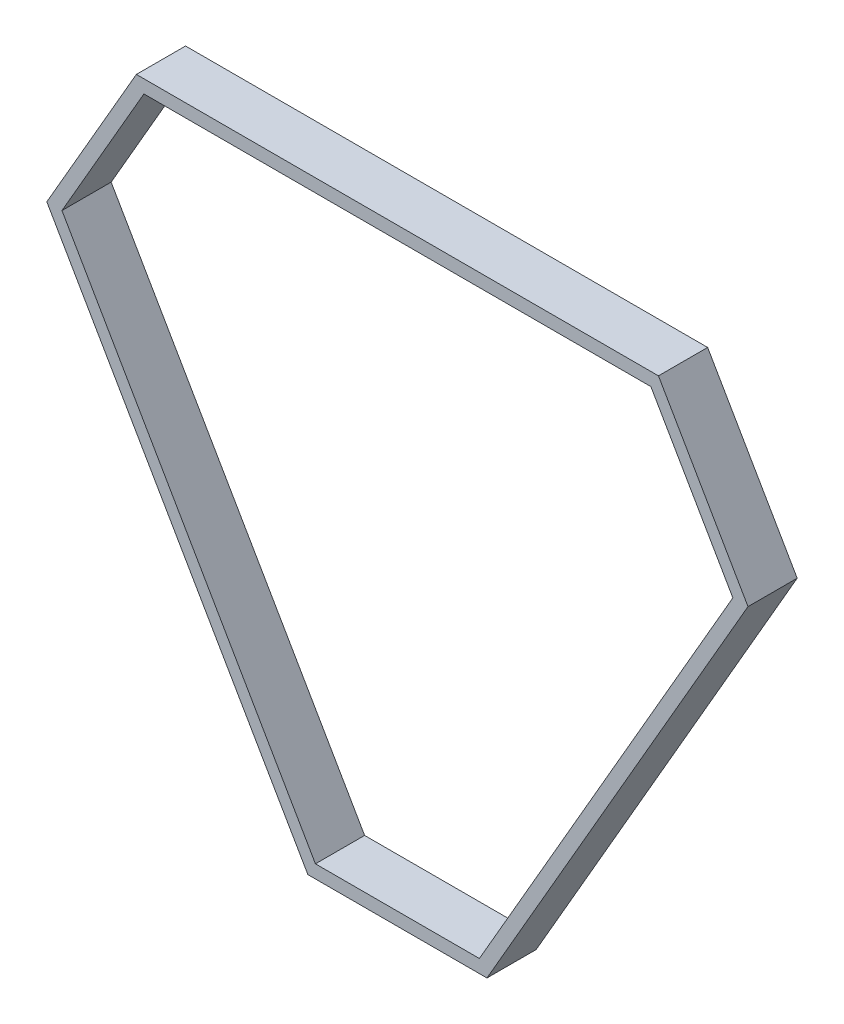
ISO-10303-21;
HEADER;
FILE_DESCRIPTION(('STEP AP214'),'2;1');
FILE_NAME('part.step','',(''),(''),'','','');
FILE_SCHEMA(('AUTOMOTIVE_DESIGN { 1 0 10303 214 1 1 1 1 }'));
ENDSEC;
DATA;
#1=APPLICATION_CONTEXT('core data for automotive mechanical design processes');
#2=APPLICATION_PROTOCOL_DEFINITION('international standard','automotive_design',2000,#1);
#3=PRODUCT_CONTEXT('',#1,'mechanical');
#4=PRODUCT('Part','Part','',(#3));
#5=PRODUCT_RELATED_PRODUCT_CATEGORY('part','',(#4));
#6=PRODUCT_DEFINITION_FORMATION('','',#4);
#7=PRODUCT_DEFINITION_CONTEXT('part definition',#1,'design');
#8=PRODUCT_DEFINITION('design','',#6,#7);
#9=PRODUCT_DEFINITION_SHAPE('','',#8);
#10=(LENGTH_UNIT() NAMED_UNIT(*) SI_UNIT(.MILLI.,.METRE.));
#11=(NAMED_UNIT(*) PLANE_ANGLE_UNIT() SI_UNIT($,.RADIAN.));
#12=(NAMED_UNIT(*) SI_UNIT($,.STERADIAN.) SOLID_ANGLE_UNIT());
#13=UNCERTAINTY_MEASURE_WITH_UNIT(LENGTH_MEASURE(1.E-05),#10,'distance_accuracy_value','');
#14=(GEOMETRIC_REPRESENTATION_CONTEXT(3) GLOBAL_UNCERTAINTY_ASSIGNED_CONTEXT((#13)) GLOBAL_UNIT_ASSIGNED_CONTEXT((#10,
#11,#12)) REPRESENTATION_CONTEXT('',''));
#15=CARTESIAN_POINT('',(0.,0.,0.));
#16=DIRECTION('',(0.,0.,1.));
#17=DIRECTION('',(1.,0.,0.));
#18=AXIS2_PLACEMENT_3D('',#15,#16,#17);
#19=CARTESIAN_POINT('',(0.,0.,-250.));
#20=DIRECTION('',(0.,0.,1.));
#21=DIRECTION('',(1.,0.,0.));
#22=AXIS2_PLACEMENT_3D('',#19,#20,#21);
#23=PLANE('',#22);
#24=DIRECTION('',(0.499999995522719,-0.866025406369398,0.));
#25=VECTOR('',#24,1.);
#26=CARTESIAN_POINT('',(-3.99997235182845,-287.07186238818,-250.));
#27=LINE('',#26,#25);
#28=CARTESIAN_POINT('',(-204.611479041461,60.3974639297883,-250.));
#29=VERTEX_POINT('',#28);
#30=CARTESIAN_POINT('',(-49.9999985666202,-207.397470720706,-250.));
#31=VERTEX_POINT('',#30);
#32=EDGE_CURVE('E146',#29,#31,#27,.T.);
#33=ORIENTED_EDGE('',*,*,#32,.T.);
#34=DIRECTION('',(1.,0.,0.));
#35=VECTOR('',#34,1.);
#36=CARTESIAN_POINT('',(3.99999495354567,-207.397470720707,-250.));
#37=LINE('',#36,#35);
#38=CARTESIAN_POINT('',(50.0000572399014,-207.397470720707,-250.));
#39=VERTEX_POINT('',#38);
#40=EDGE_CURVE('E155',#31,#39,#37,.T.);
#41=ORIENTED_EDGE('',*,*,#40,.T.);
#42=DIRECTION('',(0.499999988947861,0.866025410165394,0.));
#43=VECTOR('',#42,1.);
#44=CARTESIAN_POINT('',(250.611606942048,140.071936189287,-250.));
#45=LINE('',#44,#43);
#46=CARTESIAN_POINT('',(204.611504666339,60.3974195461969,-250.));
#47=VERTEX_POINT('',#46);
#48=EDGE_CURVE('E147',#39,#47,#45,.T.);
#49=ORIENTED_EDGE('',*,*,#48,.T.);
#50=DIRECTION('',(-0.499999999999999,0.866025403784439,0.));
#51=VECTOR('',#50,1.);
#52=CARTESIAN_POINT('',(177.611480847998,107.162832605133,-250.));
#53=LINE('',#52,#51);
#54=CARTESIAN_POINT('',(154.611477608082,147.000006790919,-250.));
#55=VERTEX_POINT('',#54);
#56=EDGE_CURVE('E150',#47,#55,#53,.T.);
#57=ORIENTED_EDGE('',*,*,#56,.T.);
#58=DIRECTION('',(-1.,-1.37761646906916E-10,0.));
#59=VECTOR('',#58,1.);
#60=CARTESIAN_POINT('',(-246.611440606458,147.000004295558,-250.));
#61=LINE('',#60,#59);
#62=CARTESIAN_POINT('',(-154.611479041461,147.000004308232,-250.));
#63=VERTEX_POINT('',#62);
#64=EDGE_CURVE('E138',#55,#63,#61,.T.);
#65=ORIENTED_EDGE('',*,*,#64,.T.);
#66=DIRECTION('',(-0.500000000000001,-0.866025403784438,0.));
#67=VECTOR('',#66,1.);
#68=CARTESIAN_POINT('',(-181.611475801544,100.234638115573,-250.));
#69=LINE('',#68,#67);
#70=EDGE_CURVE('E237',#63,#29,#69,.T.);
#71=ORIENTED_EDGE('',*,*,#70,.T.);
#72=EDGE_LOOP('',(#33,#41,#49,#57,#65,#71));
#73=FACE_BOUND('',#72,.T.);
#74=DIRECTION('',(1.,1.38387047711903E-10,0.));
#75=VECTOR('',#74,1.);
#76=CARTESIAN_POINT('',(268.467875151726,155.000000037152,-250.));
#77=LINE('',#76,#75);
#78=CARTESIAN_POINT('',(-159.230283695059,154.999999977965,-250.));
#79=VERTEX_POINT('',#78);
#80=CARTESIAN_POINT('',(159.230283669615,155.000000022035,-250.));
#81=VERTEX_POINT('',#80);
#82=EDGE_CURVE('E194',#79,#81,#77,.T.);
#83=ORIENTED_EDGE('',*,*,#82,.T.);
#84=DIRECTION('',(-0.499999999999999,0.866025403784439,0.));
#85=VECTOR('',#84,1.);
#86=CARTESIAN_POINT('',(151.539256776807,168.321249362758,-250.));
#87=LINE('',#86,#85);
#88=CARTESIAN_POINT('',(213.84907941067,60.3974707503004,-250.));
#89=VERTEX_POINT('',#88);
#90=EDGE_CURVE('E204',#89,#81,#87,.T.);
#91=ORIENTED_EDGE('',*,*,#90,.F.);
#92=DIRECTION('',(-0.499999999940077,-0.866025403819035,0.));
#93=VECTOR('',#92,1.);
#94=CARTESIAN_POINT('',(0.,-310.,-250.));
#95=LINE('',#94,#93);
#96=CARTESIAN_POINT('',(54.6187957366916,-215.397470720707,-250.));
#97=VERTEX_POINT('',#96);
#98=EDGE_CURVE('E241',#89,#97,#95,.T.);
#99=ORIENTED_EDGE('',*,*,#98,.T.);
#100=DIRECTION('',(1.,0.,0.));
#101=VECTOR('',#100,1.);
#102=CARTESIAN_POINT('',(70.0008495564807,-215.397470720707,-250.));
#103=LINE('',#102,#101);
#104=CARTESIAN_POINT('',(-54.6187957541475,-215.397470720707,-250.));
#105=VERTEX_POINT('',#104);
#106=EDGE_CURVE('E205',#105,#97,#103,.T.);
#107=ORIENTED_EDGE('',*,*,#106,.F.);
#108=DIRECTION('',(-0.5,0.866025403784439,0.));
#109=VECTOR('',#108,1.);
#110=CARTESIAN_POINT('',(-121.761531385957,-99.1028412015677,-250.));
#111=LINE('',#110,#109);
#112=CARTESIAN_POINT('',(-213.849079444843,60.3974706911128,-250.));
#113=VERTEX_POINT('',#112);
#114=EDGE_CURVE('E193',#105,#113,#111,.T.);
#115=ORIENTED_EDGE('',*,*,#114,.T.);
#116=DIRECTION('',(-0.500000000000001,-0.866025403784438,0.));
#117=VECTOR('',#116,1.);
#118=CARTESIAN_POINT('',(-221.540106333287,47.0762213579484,-250.));
#119=LINE('',#118,#117);
#120=EDGE_CURVE('E201',#79,#113,#119,.T.);
#121=ORIENTED_EDGE('',*,*,#120,.F.);
#122=EDGE_LOOP('',(#83,#91,#99,#107,#115,#121));
#123=FACE_BOUND('',#122,.T.);
#124=ADVANCED_FACE('F45',(#73,#123),#23,.F.);
#125=CARTESIAN_POINT('',(0.,0.,-220.));
#126=DIRECTION('',(0.,0.,1.));
#127=DIRECTION('',(1.,0.,0.));
#128=AXIS2_PLACEMENT_3D('',#125,#126,#127);
#129=PLANE('',#128);
#130=DIRECTION('',(1.,1.38387047711903E-10,0.));
#131=VECTOR('',#130,1.);
#132=CARTESIAN_POINT('',(268.467875151726,155.000000037152,-220.));
#133=LINE('',#132,#131);
#134=CARTESIAN_POINT('',(-159.230283695059,154.999999977965,-220.));
#135=VERTEX_POINT('',#134);
#136=CARTESIAN_POINT('',(159.230283669615,155.000000022035,-220.));
#137=VERTEX_POINT('',#136);
#138=EDGE_CURVE('E206',#135,#137,#133,.T.);
#139=ORIENTED_EDGE('',*,*,#138,.F.);
#140=DIRECTION('',(-0.500000000000001,-0.866025403784438,0.));
#141=VECTOR('',#140,1.);
#142=CARTESIAN_POINT('',(-221.540106333287,47.0762213579484,-220.));
#143=LINE('',#142,#141);
#144=CARTESIAN_POINT('',(-213.849079444843,60.3974706911128,-220.));
#145=VERTEX_POINT('',#144);
#146=EDGE_CURVE('E198',#135,#145,#143,.T.);
#147=ORIENTED_EDGE('',*,*,#146,.T.);
#148=DIRECTION('',(-0.5,0.866025403784439,0.));
#149=VECTOR('',#148,1.);
#150=CARTESIAN_POINT('',(-121.761531385957,-99.1028412015677,-220.));
#151=LINE('',#150,#149);
#152=CARTESIAN_POINT('',(-54.6187957541475,-215.397470720707,-220.));
#153=VERTEX_POINT('',#152);
#154=EDGE_CURVE('E202',#153,#145,#151,.T.);
#155=ORIENTED_EDGE('',*,*,#154,.F.);
#156=DIRECTION('',(1.,0.,0.));
#157=VECTOR('',#156,1.);
#158=CARTESIAN_POINT('',(70.0008495564807,-215.397470720707,-220.));
#159=LINE('',#158,#157);
#160=CARTESIAN_POINT('',(54.6187957366916,-215.397470720707,-220.));
#161=VERTEX_POINT('',#160);
#162=EDGE_CURVE('E195',#153,#161,#159,.T.);
#163=ORIENTED_EDGE('',*,*,#162,.T.);
#164=DIRECTION('',(-0.499999999940077,-0.866025403819035,0.));
#165=VECTOR('',#164,1.);
#166=CARTESIAN_POINT('',(0.,-310.,-220.));
#167=LINE('',#166,#165);
#168=CARTESIAN_POINT('',(213.84907941067,60.3974707503004,-220.));
#169=VERTEX_POINT('',#168);
#170=EDGE_CURVE('E208',#169,#161,#167,.T.);
#171=ORIENTED_EDGE('',*,*,#170,.F.);
#172=DIRECTION('',(-0.499999999999999,0.866025403784439,0.));
#173=VECTOR('',#172,1.);
#174=CARTESIAN_POINT('',(151.539256776807,168.321249362758,-220.));
#175=LINE('',#174,#173);
#176=EDGE_CURVE('E190',#169,#137,#175,.T.);
#177=ORIENTED_EDGE('',*,*,#176,.T.);
#178=EDGE_LOOP('',(#139,#147,#155,#163,#171,#177));
#179=FACE_BOUND('',#178,.T.);
#180=DIRECTION('',(0.499999995522719,-0.866025406369398,0.));
#181=VECTOR('',#180,1.);
#182=CARTESIAN_POINT('',(-3.99997235182845,-287.07186238818,-220.));
#183=LINE('',#182,#181);
#184=CARTESIAN_POINT('',(-204.611479041461,60.3974639297883,-220.));
#185=VERTEX_POINT('',#184);
#186=CARTESIAN_POINT('',(-49.9999985666202,-207.397470720706,-220.));
#187=VERTEX_POINT('',#186);
#188=EDGE_CURVE('E210',#185,#187,#183,.T.);
#189=ORIENTED_EDGE('',*,*,#188,.F.);
#190=DIRECTION('',(-0.500000000000001,-0.866025403784438,0.));
#191=VECTOR('',#190,1.);
#192=CARTESIAN_POINT('',(-181.611475801544,100.234638115573,-220.));
#193=LINE('',#192,#191);
#194=CARTESIAN_POINT('',(-154.611479041461,147.000004308232,-220.));
#195=VERTEX_POINT('',#194);
#196=EDGE_CURVE('E217',#195,#185,#193,.T.);
#197=ORIENTED_EDGE('',*,*,#196,.F.);
#198=DIRECTION('',(-1.,-1.37761646906916E-10,0.));
#199=VECTOR('',#198,1.);
#200=CARTESIAN_POINT('',(-246.611440606458,147.000004295558,-220.));
#201=LINE('',#200,#199);
#202=CARTESIAN_POINT('',(154.611477608082,147.000006790919,-220.));
#203=VERTEX_POINT('',#202);
#204=EDGE_CURVE('E213',#203,#195,#201,.T.);
#205=ORIENTED_EDGE('',*,*,#204,.F.);
#206=DIRECTION('',(-0.499999999999999,0.866025403784439,0.));
#207=VECTOR('',#206,1.);
#208=CARTESIAN_POINT('',(177.611480847998,107.162832605133,-220.));
#209=LINE('',#208,#207);
#210=CARTESIAN_POINT('',(204.611504666339,60.3974195461969,-220.));
#211=VERTEX_POINT('',#210);
#212=EDGE_CURVE('E63',#211,#203,#209,.T.);
#213=ORIENTED_EDGE('',*,*,#212,.F.);
#214=DIRECTION('',(0.499999988947861,0.866025410165394,0.));
#215=VECTOR('',#214,1.);
#216=CARTESIAN_POINT('',(250.611606942048,140.071936189287,-220.));
#217=LINE('',#216,#215);
#218=CARTESIAN_POINT('',(50.0000572399014,-207.397470720707,-220.));
#219=VERTEX_POINT('',#218);
#220=EDGE_CURVE('E215',#219,#211,#217,.T.);
#221=ORIENTED_EDGE('',*,*,#220,.F.);
#222=DIRECTION('',(1.,0.,0.));
#223=VECTOR('',#222,1.);
#224=CARTESIAN_POINT('',(3.99999495354567,-207.397470720707,-220.));
#225=LINE('',#224,#223);
#226=EDGE_CURVE('E219',#187,#219,#225,.T.);
#227=ORIENTED_EDGE('',*,*,#226,.F.);
#228=EDGE_LOOP('',(#189,#197,#205,#213,#221,#227));
#229=FACE_BOUND('',#228,.T.);
#230=ADVANCED_FACE('F226',(#179,#229),#129,.T.);
#231=CARTESIAN_POINT('',(-246.611440606458,147.000004295558,-100.));
#232=DIRECTION('',(1.37761646906916E-10,-1.,0.));
#233=DIRECTION('',(0.,0.,-1.));
#234=AXIS2_PLACEMENT_3D('',#231,#232,#233);
#235=PLANE('',#234);
#236=ORIENTED_EDGE('',*,*,#64,.F.);
#237=DIRECTION('',(0.,0.,-1.));
#238=VECTOR('',#237,1.);
#239=CARTESIAN_POINT('',(154.611477608082,147.000006790919,140.));
#240=LINE('',#239,#238);
#241=EDGE_CURVE('E142',#203,#55,#240,.T.);
#242=ORIENTED_EDGE('',*,*,#241,.F.);
#243=ORIENTED_EDGE('',*,*,#204,.T.);
#244=DIRECTION('',(0.,0.,-1.));
#245=VECTOR('',#244,1.);
#246=CARTESIAN_POINT('',(-154.611479041461,147.000004308232,140.));
#247=LINE('',#246,#245);
#248=EDGE_CURVE('E144',#195,#63,#247,.T.);
#249=ORIENTED_EDGE('',*,*,#248,.T.);
#250=EDGE_LOOP('',(#236,#242,#243,#249));
#251=FACE_BOUND('',#250,.T.);
#252=ADVANCED_FACE('F140',(#251),#235,.T.);
#253=CARTESIAN_POINT('',(250.611606942048,140.071936189287,0.));
#254=DIRECTION('',(-0.866025410165394,0.499999988947861,0.));
#255=DIRECTION('',(0.,0.,1.));
#256=AXIS2_PLACEMENT_3D('',#253,#254,#255);
#257=PLANE('',#256);
#258=ORIENTED_EDGE('',*,*,#48,.F.);
#259=DIRECTION('',(0.,0.,-1.));
#260=VECTOR('',#259,1.);
#261=CARTESIAN_POINT('',(50.0000572399014,-207.397470720707,0.));
#262=LINE('',#261,#260);
#263=EDGE_CURVE('E55',#219,#39,#262,.T.);
#264=ORIENTED_EDGE('',*,*,#263,.F.);
#265=ORIENTED_EDGE('',*,*,#220,.T.);
#266=DIRECTION('',(0.,0.,-1.));
#267=VECTOR('',#266,1.);
#268=CARTESIAN_POINT('',(204.611504666339,60.3974195461969,140.));
#269=LINE('',#268,#267);
#270=EDGE_CURVE('E159',#211,#47,#269,.T.);
#271=ORIENTED_EDGE('',*,*,#270,.T.);
#272=EDGE_LOOP('',(#258,#264,#265,#271));
#273=FACE_BOUND('',#272,.T.);
#274=ADVANCED_FACE('F228',(#273),#257,.T.);
#275=CARTESIAN_POINT('',(177.611480847998,107.162832605133,140.));
#276=DIRECTION('',(-0.86602540378444,-0.5,0.));
#277=DIRECTION('',(-0.5,0.86602540378444,0.));
#278=AXIS2_PLACEMENT_3D('',#275,#276,#277);
#279=PLANE('',#278);
#280=ORIENTED_EDGE('',*,*,#56,.F.);
#281=ORIENTED_EDGE('',*,*,#270,.F.);
#282=ORIENTED_EDGE('',*,*,#212,.T.);
#283=ORIENTED_EDGE('',*,*,#241,.T.);
#284=EDGE_LOOP('',(#280,#281,#282,#283));
#285=FACE_BOUND('',#284,.T.);
#286=ADVANCED_FACE('F157',(#285),#279,.T.);
#287=CARTESIAN_POINT('',(-3.99997235182845,-287.07186238818,0.));
#288=DIRECTION('',(0.866025406369398,0.499999995522719,0.));
#289=DIRECTION('',(0.,0.,-1.));
#290=AXIS2_PLACEMENT_3D('',#287,#288,#289);
#291=PLANE('',#290);
#292=ORIENTED_EDGE('',*,*,#32,.F.);
#293=DIRECTION('',(0.,0.,-1.));
#294=VECTOR('',#293,1.);
#295=CARTESIAN_POINT('',(-204.611479041461,60.3974639297883,140.));
#296=LINE('',#295,#294);
#297=EDGE_CURVE('E178',#185,#29,#296,.T.);
#298=ORIENTED_EDGE('',*,*,#297,.F.);
#299=ORIENTED_EDGE('',*,*,#188,.T.);
#300=DIRECTION('',(0.,0.,-1.));
#301=VECTOR('',#300,1.);
#302=CARTESIAN_POINT('',(-49.9999985666202,-207.397470720706,140.));
#303=LINE('',#302,#301);
#304=EDGE_CURVE('E11',#187,#31,#303,.T.);
#305=ORIENTED_EDGE('',*,*,#304,.T.);
#306=EDGE_LOOP('',(#292,#298,#299,#305));
#307=FACE_BOUND('',#306,.T.);
#308=ADVANCED_FACE('F299',(#307),#291,.T.);
#309=CARTESIAN_POINT('',(3.99999495354567,-207.397470720707,140.));
#310=DIRECTION('',(0.,1.,0.));
#311=DIRECTION('',(1.,0.,0.));
#312=AXIS2_PLACEMENT_3D('',#309,#310,#311);
#313=PLANE('',#312);
#314=ORIENTED_EDGE('',*,*,#40,.F.);
#315=ORIENTED_EDGE('',*,*,#304,.F.);
#316=ORIENTED_EDGE('',*,*,#226,.T.);
#317=ORIENTED_EDGE('',*,*,#263,.T.);
#318=EDGE_LOOP('',(#314,#315,#316,#317));
#319=FACE_BOUND('',#318,.T.);
#320=ADVANCED_FACE('F223',(#319),#313,.T.);
#321=CARTESIAN_POINT('',(-181.611475801544,100.234638115573,140.));
#322=DIRECTION('',(0.866025403784437,-0.5,0.));
#323=DIRECTION('',(0.,0.,-1.));
#324=AXIS2_PLACEMENT_3D('',#321,#322,#323);
#325=PLANE('',#324);
#326=ORIENTED_EDGE('',*,*,#70,.F.);
#327=ORIENTED_EDGE('',*,*,#248,.F.);
#328=ORIENTED_EDGE('',*,*,#196,.T.);
#329=ORIENTED_EDGE('',*,*,#297,.T.);
#330=EDGE_LOOP('',(#326,#327,#328,#329));
#331=FACE_BOUND('',#330,.T.);
#332=ADVANCED_FACE('F305',(#331),#325,.T.);
#333=CARTESIAN_POINT('',(70.0008495564807,-215.397470720707,0.));
#334=DIRECTION('',(0.,1.,0.));
#335=DIRECTION('',(1.,0.,0.));
#336=AXIS2_PLACEMENT_3D('',#333,#334,#335);
#337=PLANE('',#336);
#338=DIRECTION('',(0.,0.,1.));
#339=VECTOR('',#338,1.);
#340=CARTESIAN_POINT('',(-54.6187957541475,-215.397470720707,0.));
#341=LINE('',#340,#339);
#342=EDGE_CURVE('E182',#105,#153,#341,.T.);
#343=ORIENTED_EDGE('',*,*,#342,.F.);
#344=ORIENTED_EDGE('',*,*,#106,.T.);
#345=DIRECTION('',(0.,0.,-1.));
#346=VECTOR('',#345,1.);
#347=CARTESIAN_POINT('',(54.6187957366916,-215.397470720707,0.));
#348=LINE('',#347,#346);
#349=EDGE_CURVE('E165',#161,#97,#348,.T.);
#350=ORIENTED_EDGE('',*,*,#349,.F.);
#351=ORIENTED_EDGE('',*,*,#162,.F.);
#352=EDGE_LOOP('',(#343,#344,#350,#351));
#353=FACE_BOUND('',#352,.T.);
#354=ADVANCED_FACE('F270',(#353),#337,.F.);
#355=CARTESIAN_POINT('',(151.539256776807,168.321249362758,0.));
#356=DIRECTION('',(-0.86602540378444,-0.5,0.));
#357=DIRECTION('',(-0.5,0.86602540378444,0.));
#358=AXIS2_PLACEMENT_3D('',#355,#356,#357);
#359=PLANE('',#358);
#360=DIRECTION('',(0.,0.,1.));
#361=VECTOR('',#360,1.);
#362=CARTESIAN_POINT('',(213.84907941067,60.3974707503004,0.));
#363=LINE('',#362,#361);
#364=EDGE_CURVE('E230',#89,#169,#363,.T.);
#365=ORIENTED_EDGE('',*,*,#364,.F.);
#366=ORIENTED_EDGE('',*,*,#90,.T.);
#367=DIRECTION('',(0.,0.,-1.));
#368=VECTOR('',#367,1.);
#369=CARTESIAN_POINT('',(159.230283669615,155.000000022035,0.));
#370=LINE('',#369,#368);
#371=EDGE_CURVE('E160',#137,#81,#370,.T.);
#372=ORIENTED_EDGE('',*,*,#371,.F.);
#373=ORIENTED_EDGE('',*,*,#176,.F.);
#374=EDGE_LOOP('',(#365,#366,#372,#373));
#375=FACE_BOUND('',#374,.T.);
#376=ADVANCED_FACE('F254',(#375),#359,.F.);
#377=CARTESIAN_POINT('',(0.,-310.,0.));
#378=DIRECTION('',(0.866025403819035,-0.499999999940077,0.));
#379=DIRECTION('',(0.,0.,-1.));
#380=AXIS2_PLACEMENT_3D('',#377,#378,#379);
#381=PLANE('',#380);
#382=ORIENTED_EDGE('',*,*,#98,.F.);
#383=ORIENTED_EDGE('',*,*,#364,.T.);
#384=ORIENTED_EDGE('',*,*,#170,.T.);
#385=ORIENTED_EDGE('',*,*,#349,.T.);
#386=EDGE_LOOP('',(#382,#383,#384,#385));
#387=FACE_BOUND('',#386,.T.);
#388=ADVANCED_FACE('F263',(#387),#381,.T.);
#389=CARTESIAN_POINT('',(-221.540106333287,47.0762213579484,0.));
#390=DIRECTION('',(0.866025403784437,-0.5,0.));
#391=DIRECTION('',(0.,0.,-1.));
#392=AXIS2_PLACEMENT_3D('',#389,#390,#391);
#393=PLANE('',#392);
#394=DIRECTION('',(0.,0.,1.));
#395=VECTOR('',#394,1.);
#396=CARTESIAN_POINT('',(-159.230283695059,154.999999977965,0.));
#397=LINE('',#396,#395);
#398=EDGE_CURVE('E168',#79,#135,#397,.T.);
#399=ORIENTED_EDGE('',*,*,#398,.F.);
#400=ORIENTED_EDGE('',*,*,#120,.T.);
#401=DIRECTION('',(0.,0.,-1.));
#402=VECTOR('',#401,1.);
#403=CARTESIAN_POINT('',(-213.849079444843,60.3974706911128,0.));
#404=LINE('',#403,#402);
#405=EDGE_CURVE('E186',#145,#113,#404,.T.);
#406=ORIENTED_EDGE('',*,*,#405,.F.);
#407=ORIENTED_EDGE('',*,*,#146,.F.);
#408=EDGE_LOOP('',(#399,#400,#406,#407));
#409=FACE_BOUND('',#408,.T.);
#410=ADVANCED_FACE('F274',(#409),#393,.F.);
#411=CARTESIAN_POINT('',(268.467875151726,155.000000037152,0.));
#412=DIRECTION('',(-1.38387047711903E-10,1.,0.));
#413=DIRECTION('',(0.,0.,1.));
#414=AXIS2_PLACEMENT_3D('',#411,#412,#413);
#415=PLANE('',#414);
#416=ORIENTED_EDGE('',*,*,#82,.F.);
#417=ORIENTED_EDGE('',*,*,#398,.T.);
#418=ORIENTED_EDGE('',*,*,#138,.T.);
#419=ORIENTED_EDGE('',*,*,#371,.T.);
#420=EDGE_LOOP('',(#416,#417,#418,#419));
#421=FACE_BOUND('',#420,.T.);
#422=ADVANCED_FACE('F259',(#421),#415,.T.);
#423=CARTESIAN_POINT('',(-121.761531385957,-99.1028412015677,-265.));
#424=DIRECTION('',(-0.866025403784439,-0.5,0.));
#425=DIRECTION('',(-0.5,0.866025403784439,0.));
#426=AXIS2_PLACEMENT_3D('',#423,#424,#425);
#427=PLANE('',#426);
#428=ORIENTED_EDGE('',*,*,#114,.F.);
#429=ORIENTED_EDGE('',*,*,#342,.T.);
#430=ORIENTED_EDGE('',*,*,#154,.T.);
#431=ORIENTED_EDGE('',*,*,#405,.T.);
#432=EDGE_LOOP('',(#428,#429,#430,#431));
#433=FACE_BOUND('',#432,.T.);
#434=ADVANCED_FACE('F47',(#433),#427,.T.);
#435=CLOSED_SHELL('',(#124,#230,#252,#274,#286,#308,#320,#332,#354,#376,#388,#410,#422,#434));
#436=MANIFOLD_SOLID_BREP('B2',#435);
#437=ADVANCED_BREP_SHAPE_REPRESENTATION('',(#18,#436),#14);
#438=SHAPE_DEFINITION_REPRESENTATION(#9,#437);
ENDSEC;
END-ISO-10303-21;
